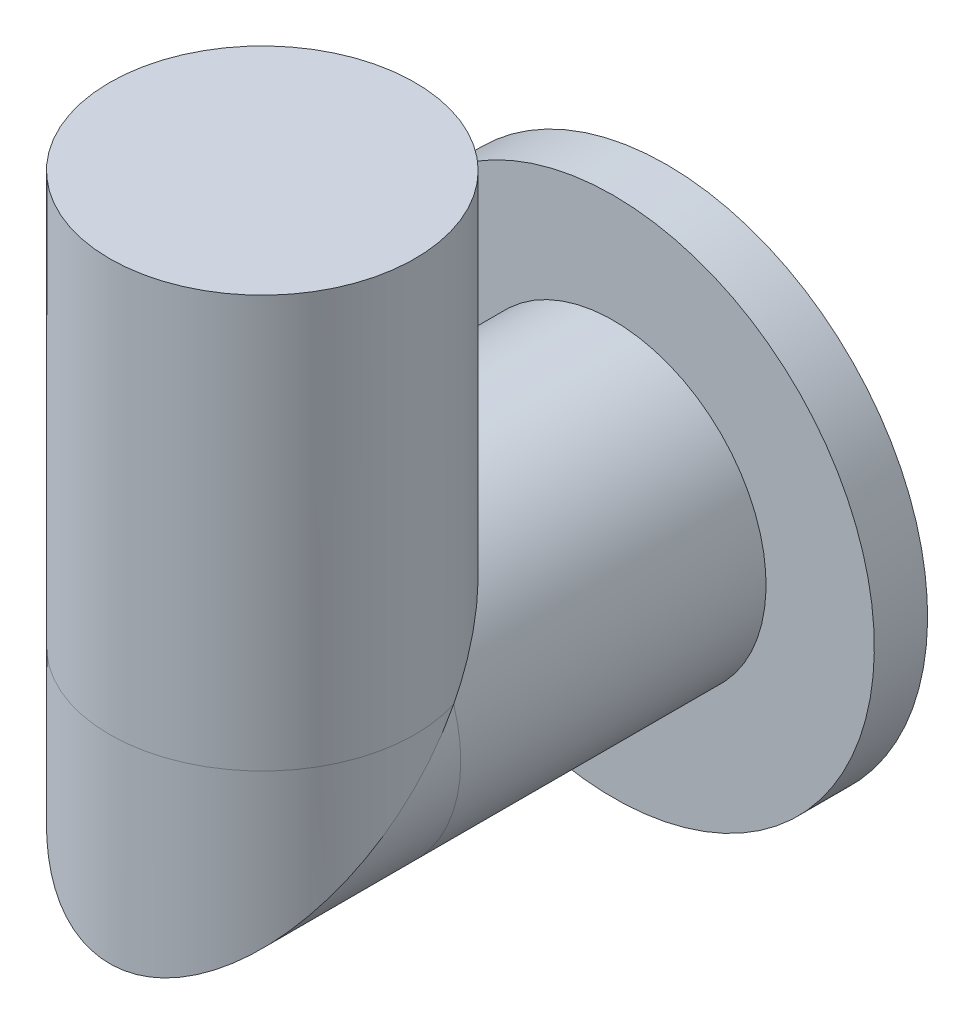
ISO-10303-21;
HEADER;
FILE_DESCRIPTION(('STEP AP214'),'2;1');
FILE_NAME('part.step','',(''),(''),'','','');
FILE_SCHEMA(('AUTOMOTIVE_DESIGN { 1 0 10303 214 1 1 1 1 }'));
ENDSEC;
DATA;
#1=APPLICATION_CONTEXT('core data for automotive mechanical design processes');
#2=APPLICATION_PROTOCOL_DEFINITION('international standard','automotive_design',2000,#1);
#3=PRODUCT_CONTEXT('',#1,'mechanical');
#4=PRODUCT('Part','Part','',(#3));
#5=PRODUCT_RELATED_PRODUCT_CATEGORY('part','',(#4));
#6=PRODUCT_DEFINITION_FORMATION('','',#4);
#7=PRODUCT_DEFINITION_CONTEXT('part definition',#1,'design');
#8=PRODUCT_DEFINITION('design','',#6,#7);
#9=PRODUCT_DEFINITION_SHAPE('','',#8);
#10=(LENGTH_UNIT() NAMED_UNIT(*) SI_UNIT(.MILLI.,.METRE.));
#11=(NAMED_UNIT(*) PLANE_ANGLE_UNIT() SI_UNIT($,.RADIAN.));
#12=(NAMED_UNIT(*) SI_UNIT($,.STERADIAN.) SOLID_ANGLE_UNIT());
#13=UNCERTAINTY_MEASURE_WITH_UNIT(LENGTH_MEASURE(1.E-05),#10,'distance_accuracy_value','');
#14=(GEOMETRIC_REPRESENTATION_CONTEXT(3) GLOBAL_UNCERTAINTY_ASSIGNED_CONTEXT((#13)) GLOBAL_UNIT_ASSIGNED_CONTEXT((#10,
#11,#12)) REPRESENTATION_CONTEXT('',''));
#15=CARTESIAN_POINT('',(0.,0.,0.));
#16=DIRECTION('',(0.,0.,1.));
#17=DIRECTION('',(1.,0.,0.));
#18=AXIS2_PLACEMENT_3D('',#15,#16,#17);
#19=CARTESIAN_POINT('',(0.,0.,0.));
#20=DIRECTION('',(0.,1.,0.));
#21=DIRECTION('',(0.,0.,1.));
#22=AXIS2_PLACEMENT_3D('',#19,#20,#21);
#23=PLANE('',#22);
#24=CARTESIAN_POINT('',(0.,0.,0.));
#25=DIRECTION('',(0.,1.,0.));
#26=DIRECTION('',(0.,0.,1.));
#27=AXIS2_PLACEMENT_3D('',#24,#25,#26);
#28=CIRCLE('',#27,1000.);
#29=CARTESIAN_POINT('',(0.,0.,1000.));
#30=VERTEX_POINT('',#29);
#31=EDGE_CURVE('E73',#30,#30,#28,.T.);
#32=ORIENTED_EDGE('',*,*,#31,.T.);
#33=EDGE_LOOP('',(#32));
#34=FACE_BOUND('',#33,.T.);
#35=ADVANCED_FACE('F43',(#34),#23,.T.);
#36=CARTESIAN_POINT('',(0.,-2999.81796426395,1100.1));
#37=DIRECTION('',(0.,0.,-1.));
#38=DIRECTION('',(-1.,0.,0.));
#39=AXIS2_PLACEMENT_3D('',#36,#37,#38);
#40=CYLINDRICAL_SURFACE('',#39,1000.);
#41=CARTESIAN_POINT('',(0.,-2999.81796426395,0.));
#42=DIRECTION('',(0.,-0.707106781186548,-0.707106781186548));
#43=DIRECTION('',(0.,-0.707106781186548,0.707106781186548));
#44=AXIS2_PLACEMENT_3D('',#41,#42,#43);
#45=ELLIPSE('',#44,1414.21356237309,1000.);
#46=CARTESIAN_POINT('',(953.939201416945,-2699.81796426394,-300.000000000002));
#47=VERTEX_POINT('',#46);
#48=CARTESIAN_POINT('',(-953.939201416945,-2699.81796426394,-300.000000000002));
#49=VERTEX_POINT('',#48);
#50=EDGE_CURVE('E11',#47,#49,#45,.T.);
#51=ORIENTED_EDGE('',*,*,#50,.T.);
#52=CARTESIAN_POINT('',(0.,-2999.81796426395,-300.000000000002));
#53=DIRECTION('',(0.,0.,1.));
#54=DIRECTION('',(0.,-1.,0.));
#55=AXIS2_PLACEMENT_3D('',#52,#53,#54);
#56=CIRCLE('',#55,1000.);
#57=EDGE_CURVE('E46',#49,#47,#56,.T.);
#58=ORIENTED_EDGE('',*,*,#57,.T.);
#59=EDGE_LOOP('',(#51,#58));
#60=FACE_BOUND('',#59,.T.);
#61=ADVANCED_FACE('F75',(#60),#40,.T.);
#62=CARTESIAN_POINT('',(0.,-2999.81796426395,-300.000000000002));
#63=DIRECTION('',(0.,0.,-1.));
#64=DIRECTION('',(-1.,0.,0.));
#65=AXIS2_PLACEMENT_3D('',#62,#63,#64);
#66=CYLINDRICAL_SURFACE('',#65,1000.);
#67=CARTESIAN_POINT('',(0.,-2999.81796426395,0.));
#68=DIRECTION('',(0.,-0.707106781186548,-0.707106781186548));
#69=DIRECTION('',(0.,-0.707106781186548,0.707106781186548));
#70=AXIS2_PLACEMENT_3D('',#67,#68,#69);
#71=ELLIPSE('',#70,1414.21356237309,1000.);
#72=EDGE_CURVE('E52',#49,#47,#71,.T.);
#73=ORIENTED_EDGE('',*,*,#72,.T.);
#74=ORIENTED_EDGE('',*,*,#57,.F.);
#75=EDGE_LOOP('',(#73,#74));
#76=FACE_BOUND('',#75,.T.);
#77=CARTESIAN_POINT('',(0.,-2999.81796426395,-2300.));
#78=DIRECTION('',(0.,0.,1.));
#79=DIRECTION('',(0.,-1.,0.));
#80=AXIS2_PLACEMENT_3D('',#77,#78,#79);
#81=CIRCLE('',#80,1000.);
#82=CARTESIAN_POINT('',(0.,-3999.81796426395,-2300.));
#83=VERTEX_POINT('',#82);
#84=EDGE_CURVE('E74',#83,#83,#81,.T.);
#85=ORIENTED_EDGE('',*,*,#84,.T.);
#86=EDGE_LOOP('',(#85));
#87=FACE_BOUND('',#86,.T.);
#88=ADVANCED_FACE('F69',(#76,#87),#66,.T.);
#89=CARTESIAN_POINT('',(0.,-2699.81796426394,0.));
#90=DIRECTION('',(0.,-1.,0.));
#91=DIRECTION('',(0.,0.,-1.));
#92=AXIS2_PLACEMENT_3D('',#89,#90,#91);
#93=CYLINDRICAL_SURFACE('',#92,1000.);
#94=CARTESIAN_POINT('',(0.,-2699.81796426394,0.));
#95=DIRECTION('',(0.,1.,0.));
#96=DIRECTION('',(0.,0.,1.));
#97=AXIS2_PLACEMENT_3D('',#94,#95,#96);
#98=CIRCLE('',#97,1000.);
#99=EDGE_CURVE('E65',#49,#47,#98,.T.);
#100=ORIENTED_EDGE('',*,*,#99,.F.);
#101=ORIENTED_EDGE('',*,*,#50,.F.);
#102=EDGE_LOOP('',(#100,#101));
#103=FACE_BOUND('',#102,.T.);
#104=ADVANCED_FACE('F76',(#103),#93,.T.);
#105=CARTESIAN_POINT('',(0.,0.,0.));
#106=DIRECTION('',(0.,-1.,0.));
#107=DIRECTION('',(0.,0.,-1.));
#108=AXIS2_PLACEMENT_3D('',#105,#106,#107);
#109=CYLINDRICAL_SURFACE('',#108,1000.);
#110=ORIENTED_EDGE('',*,*,#31,.F.);
#111=EDGE_LOOP('',(#110));
#112=FACE_BOUND('',#111,.T.);
#113=ORIENTED_EDGE('',*,*,#99,.T.);
#114=ORIENTED_EDGE('',*,*,#72,.F.);
#115=EDGE_LOOP('',(#113,#114));
#116=FACE_BOUND('',#115,.T.);
#117=ADVANCED_FACE('F64',(#112,#116),#109,.T.);
#118=CARTESIAN_POINT('',(0.,-2999.81796426395,-2649.));
#119=DIRECTION('',(0.,0.,1.));
#120=DIRECTION('',(0.,-1.,0.));
#121=AXIS2_PLACEMENT_3D('',#118,#119,#120);
#122=CYLINDRICAL_SURFACE('',#121,1709.36763806991);
#123=CARTESIAN_POINT('',(0.,-2999.81796426395,-2649.));
#124=DIRECTION('',(0.,0.,-1.));
#125=DIRECTION('',(0.,1.,0.));
#126=AXIS2_PLACEMENT_3D('',#123,#124,#125);
#127=CIRCLE('',#126,1709.36763806991);
#128=CARTESIAN_POINT('',(0.,-1290.45032619403,-2649.));
#129=VERTEX_POINT('',#128);
#130=EDGE_CURVE('E84',#129,#129,#127,.T.);
#131=ORIENTED_EDGE('',*,*,#130,.F.);
#132=EDGE_LOOP('',(#131));
#133=FACE_BOUND('',#132,.T.);
#134=CARTESIAN_POINT('',(0.,-2999.81796426395,-2300.));
#135=DIRECTION('',(0.,0.,-1.));
#136=DIRECTION('',(0.,1.,0.));
#137=AXIS2_PLACEMENT_3D('',#134,#135,#136);
#138=CIRCLE('',#137,1709.36763806991);
#139=CARTESIAN_POINT('',(0.,-1290.45032619403,-2300.));
#140=VERTEX_POINT('',#139);
#141=EDGE_CURVE('E88',#140,#140,#138,.T.);
#142=ORIENTED_EDGE('',*,*,#141,.T.);
#143=EDGE_LOOP('',(#142));
#144=FACE_BOUND('',#143,.T.);
#145=ADVANCED_FACE('F97',(#133,#144),#122,.T.);
#146=CARTESIAN_POINT('',(0.,-2999.81796426395,-2649.));
#147=DIRECTION('',(0.,0.,-1.));
#148=DIRECTION('',(0.,1.,0.));
#149=AXIS2_PLACEMENT_3D('',#146,#147,#148);
#150=PLANE('',#149);
#151=ORIENTED_EDGE('',*,*,#130,.T.);
#152=EDGE_LOOP('',(#151));
#153=FACE_BOUND('',#152,.T.);
#154=ADVANCED_FACE('F101',(#153),#150,.T.);
#155=CARTESIAN_POINT('',(0.,-2999.81796426395,-2300.));
#156=DIRECTION('',(0.,0.,-1.));
#157=DIRECTION('',(0.,1.,0.));
#158=AXIS2_PLACEMENT_3D('',#155,#156,#157);
#159=PLANE('',#158);
#160=ORIENTED_EDGE('',*,*,#84,.F.);
#161=EDGE_LOOP('',(#160));
#162=FACE_BOUND('',#161,.T.);
#163=ORIENTED_EDGE('',*,*,#141,.F.);
#164=EDGE_LOOP('',(#163));
#165=FACE_BOUND('',#164,.T.);
#166=ADVANCED_FACE('F99',(#162,#165),#159,.F.);
#167=CLOSED_SHELL('',(#35,#61,#88,#104,#117,#145,#154,#166));
#168=MANIFOLD_SOLID_BREP('B2',#167);
#169=ADVANCED_BREP_SHAPE_REPRESENTATION('',(#18,#168),#14);
#170=SHAPE_DEFINITION_REPRESENTATION(#9,#169);
ENDSEC;
END-ISO-10303-21;
